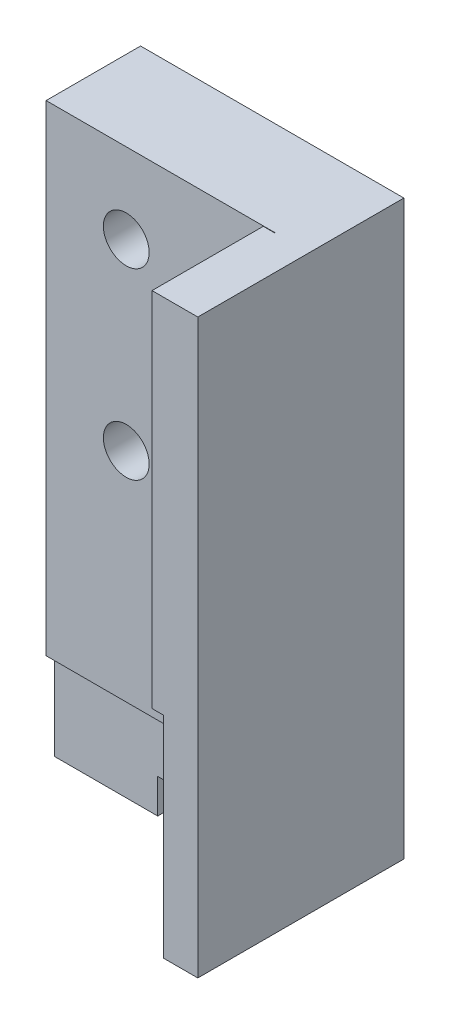
ISO-10303-21;
HEADER;
FILE_DESCRIPTION(('STEP AP214'),'2;1');
FILE_NAME('part.step','',(''),(''),'','','');
FILE_SCHEMA(('AUTOMOTIVE_DESIGN { 1 0 10303 214 1 1 1 1 }'));
ENDSEC;
DATA;
#1=APPLICATION_CONTEXT('core data for automotive mechanical design processes');
#2=APPLICATION_PROTOCOL_DEFINITION('international standard','automotive_design',2000,#1);
#3=PRODUCT_CONTEXT('',#1,'mechanical');
#4=PRODUCT('Part','Part','',(#3));
#5=PRODUCT_RELATED_PRODUCT_CATEGORY('part','',(#4));
#6=PRODUCT_DEFINITION_FORMATION('','',#4);
#7=PRODUCT_DEFINITION_CONTEXT('part definition',#1,'design');
#8=PRODUCT_DEFINITION('design','',#6,#7);
#9=PRODUCT_DEFINITION_SHAPE('','',#8);
#10=(LENGTH_UNIT() NAMED_UNIT(*) SI_UNIT(.MILLI.,.METRE.));
#11=(NAMED_UNIT(*) PLANE_ANGLE_UNIT() SI_UNIT($,.RADIAN.));
#12=(NAMED_UNIT(*) SI_UNIT($,.STERADIAN.) SOLID_ANGLE_UNIT());
#13=UNCERTAINTY_MEASURE_WITH_UNIT(LENGTH_MEASURE(1.E-05),#10,'distance_accuracy_value','');
#14=(GEOMETRIC_REPRESENTATION_CONTEXT(3) GLOBAL_UNCERTAINTY_ASSIGNED_CONTEXT((#13)) GLOBAL_UNIT_ASSIGNED_CONTEXT((#10,
#11,#12)) REPRESENTATION_CONTEXT('',''));
#15=CARTESIAN_POINT('',(0.,0.,0.));
#16=DIRECTION('',(0.,0.,1.));
#17=DIRECTION('',(1.,0.,0.));
#18=AXIS2_PLACEMENT_3D('',#15,#16,#17);
#19=CARTESIAN_POINT('',(20.,50.,9.));
#20=DIRECTION('',(1.,0.,0.));
#21=DIRECTION('',(0.,0.,-1.));
#22=AXIS2_PLACEMENT_3D('',#19,#20,#21);
#23=PLANE('',#22);
#24=DIRECTION('',(0.,-1.,0.));
#25=VECTOR('',#24,1.);
#26=CARTESIAN_POINT('',(20.,50.,-0.720000000000005));
#27=LINE('',#26,#25);
#28=CARTESIAN_POINT('',(20.,50.,-0.720000000000005));
#29=VERTEX_POINT('',#28);
#30=CARTESIAN_POINT('',(20.,18.3832892423228,-0.720000000000005));
#31=VERTEX_POINT('',#30);
#32=EDGE_CURVE('E169',#29,#31,#27,.T.);
#33=ORIENTED_EDGE('',*,*,#32,.F.);
#34=DIRECTION('',(0.,0.,1.));
#35=VECTOR('',#34,1.);
#36=CARTESIAN_POINT('',(20.,50.,9.));
#37=LINE('',#36,#35);
#38=CARTESIAN_POINT('',(20.,50.,-0.75));
#39=VERTEX_POINT('',#38);
#40=EDGE_CURVE('E151',#39,#29,#37,.T.);
#41=ORIENTED_EDGE('',*,*,#40,.F.);
#42=DIRECTION('',(0.,1.,0.));
#43=VECTOR('',#42,1.);
#44=CARTESIAN_POINT('',(20.,8.,-0.75));
#45=LINE('',#44,#43);
#46=CARTESIAN_POINT('',(20.,8.,-0.75));
#47=VERTEX_POINT('',#46);
#48=EDGE_CURVE('E184',#47,#39,#45,.T.);
#49=ORIENTED_EDGE('',*,*,#48,.F.);
#50=DIRECTION('',(0.,0.,1.));
#51=VECTOR('',#50,1.);
#52=CARTESIAN_POINT('',(20.,8.,0.));
#53=LINE('',#52,#51);
#54=CARTESIAN_POINT('',(20.,8.,-1.5));
#55=VERTEX_POINT('',#54);
#56=EDGE_CURVE('E238',#55,#47,#53,.T.);
#57=ORIENTED_EDGE('',*,*,#56,.F.);
#58=DIRECTION('',(0.,-1.,0.));
#59=VECTOR('',#58,1.);
#60=CARTESIAN_POINT('',(20.,8.,-1.5));
#61=LINE('',#60,#59);
#62=CARTESIAN_POINT('',(20.,0.,-1.5));
#63=VERTEX_POINT('',#62);
#64=EDGE_CURVE('E244',#55,#63,#61,.T.);
#65=ORIENTED_EDGE('',*,*,#64,.T.);
#66=DIRECTION('',(0.,0.,1.));
#67=VECTOR('',#66,1.);
#68=CARTESIAN_POINT('',(20.,0.,9.));
#69=LINE('',#68,#67);
#70=CARTESIAN_POINT('',(20.,0.,9.));
#71=VERTEX_POINT('',#70);
#72=EDGE_CURVE('E247',#63,#71,#69,.T.);
#73=ORIENTED_EDGE('',*,*,#72,.T.);
#74=DIRECTION('',(0.,-1.,0.));
#75=VECTOR('',#74,1.);
#76=CARTESIAN_POINT('',(20.,50.,9.));
#77=LINE('',#76,#75);
#78=CARTESIAN_POINT('',(20.,18.3832892423228,9.));
#79=VERTEX_POINT('',#78);
#80=EDGE_CURVE('E11',#79,#71,#77,.T.);
#81=ORIENTED_EDGE('',*,*,#80,.F.);
#82=DIRECTION('',(0.,0.,1.));
#83=VECTOR('',#82,1.);
#84=CARTESIAN_POINT('',(20.,18.3832892423228,9.));
#85=LINE('',#84,#83);
#86=EDGE_CURVE('E167',#31,#79,#85,.T.);
#87=ORIENTED_EDGE('',*,*,#86,.F.);
#88=EDGE_LOOP('',(#33,#41,#49,#57,#65,#73,#81,#87));
#89=FACE_BOUND('',#88,.T.);
#90=ADVANCED_FACE('F33',(#89),#23,.F.);
#91=CARTESIAN_POINT('',(0.,50.,0.));
#92=DIRECTION('',(1.,0.,0.));
#93=DIRECTION('',(0.,0.,-1.));
#94=AXIS2_PLACEMENT_3D('',#91,#92,#93);
#95=PLANE('',#94);
#96=DIRECTION('',(0.,-1.,0.));
#97=VECTOR('',#96,1.);
#98=CARTESIAN_POINT('',(0.,50.,-0.75));
#99=LINE('',#98,#97);
#100=CARTESIAN_POINT('',(0.,50.,-0.75));
#101=VERTEX_POINT('',#100);
#102=CARTESIAN_POINT('',(0.,8.,-0.75));
#103=VERTEX_POINT('',#102);
#104=EDGE_CURVE('E48',#101,#103,#99,.T.);
#105=ORIENTED_EDGE('',*,*,#104,.F.);
#106=DIRECTION('',(0.,0.,1.));
#107=VECTOR('',#106,1.);
#108=CARTESIAN_POINT('',(0.,50.,0.));
#109=LINE('',#108,#107);
#110=CARTESIAN_POINT('',(0.,50.,-9.));
#111=VERTEX_POINT('',#110);
#112=EDGE_CURVE('E254',#111,#101,#109,.T.);
#113=ORIENTED_EDGE('',*,*,#112,.F.);
#114=DIRECTION('',(0.,-1.,0.));
#115=VECTOR('',#114,1.);
#116=CARTESIAN_POINT('',(0.,50.,-9.));
#117=LINE('',#116,#115);
#118=CARTESIAN_POINT('',(0.,0.,-9.));
#119=VERTEX_POINT('',#118);
#120=EDGE_CURVE('E257',#111,#119,#117,.T.);
#121=ORIENTED_EDGE('',*,*,#120,.T.);
#122=DIRECTION('',(0.,0.,1.));
#123=VECTOR('',#122,1.);
#124=CARTESIAN_POINT('',(0.,0.,0.));
#125=LINE('',#124,#123);
#126=CARTESIAN_POINT('',(0.,0.,-1.5));
#127=VERTEX_POINT('',#126);
#128=EDGE_CURVE('E249',#119,#127,#125,.T.);
#129=ORIENTED_EDGE('',*,*,#128,.T.);
#130=DIRECTION('',(0.,-1.,0.));
#131=VECTOR('',#130,1.);
#132=CARTESIAN_POINT('',(0.,8.,-1.5));
#133=LINE('',#132,#131);
#134=CARTESIAN_POINT('',(0.,8.,-1.5));
#135=VERTEX_POINT('',#134);
#136=EDGE_CURVE('E241',#135,#127,#133,.T.);
#137=ORIENTED_EDGE('',*,*,#136,.F.);
#138=DIRECTION('',(0.,0.,-1.));
#139=VECTOR('',#138,1.);
#140=CARTESIAN_POINT('',(0.,8.,0.));
#141=LINE('',#140,#139);
#142=EDGE_CURVE('E232',#103,#135,#141,.T.);
#143=ORIENTED_EDGE('',*,*,#142,.F.);
#144=EDGE_LOOP('',(#105,#113,#121,#129,#137,#143));
#145=FACE_BOUND('',#144,.T.);
#146=ADVANCED_FACE('F294',(#145),#95,.F.);
#147=CARTESIAN_POINT('',(0.,8.,0.));
#148=DIRECTION('',(0.,-1.,0.));
#149=DIRECTION('',(0.,0.,-1.));
#150=AXIS2_PLACEMENT_3D('',#147,#148,#149);
#151=PLANE('',#150);
#152=ORIENTED_EDGE('',*,*,#56,.T.);
#153=DIRECTION('',(1.,0.,0.));
#154=VECTOR('',#153,1.);
#155=CARTESIAN_POINT('',(0.,8.,-0.75));
#156=LINE('',#155,#154);
#157=EDGE_CURVE('E182',#103,#47,#156,.T.);
#158=ORIENTED_EDGE('',*,*,#157,.F.);
#159=ORIENTED_EDGE('',*,*,#142,.T.);
#160=DIRECTION('',(1.,0.,0.));
#161=VECTOR('',#160,1.);
#162=CARTESIAN_POINT('',(0.,8.,-1.5));
#163=LINE('',#162,#161);
#164=EDGE_CURVE('E234',#135,#55,#163,.T.);
#165=ORIENTED_EDGE('',*,*,#164,.T.);
#166=EDGE_LOOP('',(#152,#158,#159,#165));
#167=FACE_BOUND('',#166,.T.);
#168=ADVANCED_FACE('F300',(#167),#151,.T.);
#169=CARTESIAN_POINT('',(7.,43.,5.65685424949238));
#170=DIRECTION('',(0.,0.,-1.));
#171=DIRECTION('',(-1.,0.,0.));
#172=AXIS2_PLACEMENT_3D('',#169,#170,#171);
#173=CYLINDRICAL_SURFACE('',#172,2.);
#174=CARTESIAN_POINT('',(7.,43.,-9.));
#175=DIRECTION('',(0.,0.,-1.));
#176=DIRECTION('',(-1.,0.,0.));
#177=AXIS2_PLACEMENT_3D('',#174,#175,#176);
#178=CIRCLE('',#177,2.);
#179=CARTESIAN_POINT('',(5.,43.,-9.));
#180=VERTEX_POINT('',#179);
#181=EDGE_CURVE('E192',#180,#180,#178,.T.);
#182=ORIENTED_EDGE('',*,*,#181,.T.);
#183=EDGE_LOOP('',(#182));
#184=FACE_BOUND('',#183,.T.);
#185=CARTESIAN_POINT('',(7.,43.,-0.75));
#186=DIRECTION('',(0.,0.,1.));
#187=DIRECTION('',(1.,0.,0.));
#188=AXIS2_PLACEMENT_3D('',#185,#186,#187);
#189=CIRCLE('',#188,2.);
#190=CARTESIAN_POINT('',(9.,43.,-0.75));
#191=VERTEX_POINT('',#190);
#192=EDGE_CURVE('E189',#191,#191,#189,.F.);
#193=ORIENTED_EDGE('',*,*,#192,.F.);
#194=EDGE_LOOP('',(#193));
#195=FACE_BOUND('',#194,.T.);
#196=ADVANCED_FACE('F318',(#184,#195),#173,.F.);
#197=CARTESIAN_POINT('',(7.,27.,5.65685424949238));
#198=DIRECTION('',(0.,0.,-1.));
#199=DIRECTION('',(-1.,0.,0.));
#200=AXIS2_PLACEMENT_3D('',#197,#198,#199);
#201=CYLINDRICAL_SURFACE('',#200,2.);
#202=CARTESIAN_POINT('',(7.,27.,-9.));
#203=DIRECTION('',(0.,0.,-1.));
#204=DIRECTION('',(-1.,0.,0.));
#205=AXIS2_PLACEMENT_3D('',#202,#203,#204);
#206=CIRCLE('',#205,2.);
#207=CARTESIAN_POINT('',(5.,27.,-9.));
#208=VERTEX_POINT('',#207);
#209=EDGE_CURVE('E193',#208,#208,#206,.T.);
#210=ORIENTED_EDGE('',*,*,#209,.T.);
#211=EDGE_LOOP('',(#210));
#212=FACE_BOUND('',#211,.T.);
#213=CARTESIAN_POINT('',(7.,27.,-0.75));
#214=DIRECTION('',(0.,0.,1.));
#215=DIRECTION('',(1.,0.,0.));
#216=AXIS2_PLACEMENT_3D('',#213,#214,#215);
#217=CIRCLE('',#216,2.);
#218=CARTESIAN_POINT('',(9.,27.,-0.75));
#219=VERTEX_POINT('',#218);
#220=EDGE_CURVE('E36',#219,#219,#217,.F.);
#221=ORIENTED_EDGE('',*,*,#220,.F.);
#222=EDGE_LOOP('',(#221));
#223=FACE_BOUND('',#222,.T.);
#224=ADVANCED_FACE('F320',(#212,#223),#201,.F.);
#225=CARTESIAN_POINT('',(0.,0.,0.));
#226=DIRECTION('',(0.,-1.,0.));
#227=DIRECTION('',(0.,0.,-1.));
#228=AXIS2_PLACEMENT_3D('',#225,#226,#227);
#229=PLANE('',#228);
#230=DIRECTION('',(0.,0.,1.));
#231=VECTOR('',#230,1.);
#232=CARTESIAN_POINT('',(9.,0.,-13.2426406871193));
#233=LINE('',#232,#231);
#234=CARTESIAN_POINT('',(9.,0.,-9.));
#235=VERTEX_POINT('',#234);
#236=CARTESIAN_POINT('',(9.,0.,-1.5));
#237=VERTEX_POINT('',#236);
#238=EDGE_CURVE('E213',#235,#237,#233,.T.);
#239=ORIENTED_EDGE('',*,*,#238,.T.);
#240=DIRECTION('',(1.,0.,0.));
#241=VECTOR('',#240,1.);
#242=CARTESIAN_POINT('',(0.,0.,-1.5));
#243=LINE('',#242,#241);
#244=EDGE_CURVE('E235',#127,#237,#243,.T.);
#245=ORIENTED_EDGE('',*,*,#244,.F.);
#246=ORIENTED_EDGE('',*,*,#128,.F.);
#247=DIRECTION('',(-1.,0.,0.));
#248=VECTOR('',#247,1.);
#249=CARTESIAN_POINT('',(0.,0.,-9.));
#250=LINE('',#249,#248);
#251=EDGE_CURVE('E264',#235,#119,#250,.T.);
#252=ORIENTED_EDGE('',*,*,#251,.F.);
#253=EDGE_LOOP('',(#239,#245,#246,#252));
#254=FACE_BOUND('',#253,.T.);
#255=CARTESIAN_POINT('',(5.,0.,-5.5));
#256=DIRECTION('',(0.,-1.,0.));
#257=DIRECTION('',(0.,0.,-1.));
#258=AXIS2_PLACEMENT_3D('',#255,#256,#257);
#259=CIRCLE('',#258,0.500000000000001);
#260=CARTESIAN_POINT('',(5.,0.,-6.));
#261=VERTEX_POINT('',#260);
#262=EDGE_CURVE('E224',#261,#261,#259,.T.);
#263=ORIENTED_EDGE('',*,*,#262,.F.);
#264=EDGE_LOOP('',(#263));
#265=FACE_BOUND('',#264,.T.);
#266=ADVANCED_FACE('F327',(#254,#265),#229,.T.);
#267=CARTESIAN_POINT('',(23.,50.,9.));
#268=DIRECTION('',(0.,0.,-1.));
#269=DIRECTION('',(-1.,0.,0.));
#270=AXIS2_PLACEMENT_3D('',#267,#268,#269);
#271=PLANE('',#270);
#272=DIRECTION('',(1.,0.,0.));
#273=VECTOR('',#272,1.);
#274=CARTESIAN_POINT('',(23.,0.,9.));
#275=LINE('',#274,#273);
#276=CARTESIAN_POINT('',(23.,0.,9.));
#277=VERTEX_POINT('',#276);
#278=EDGE_CURVE('E260',#71,#277,#275,.T.);
#279=ORIENTED_EDGE('',*,*,#278,.T.);
#280=DIRECTION('',(0.,-1.,0.));
#281=VECTOR('',#280,1.);
#282=CARTESIAN_POINT('',(23.,50.,9.));
#283=LINE('',#282,#281);
#284=CARTESIAN_POINT('',(23.,50.,9.));
#285=VERTEX_POINT('',#284);
#286=EDGE_CURVE('E41',#285,#277,#283,.T.);
#287=ORIENTED_EDGE('',*,*,#286,.F.);
#288=DIRECTION('',(1.,0.,0.));
#289=VECTOR('',#288,1.);
#290=CARTESIAN_POINT('',(23.,50.,9.));
#291=LINE('',#290,#289);
#292=CARTESIAN_POINT('',(19.,50.,9.));
#293=VERTEX_POINT('',#292);
#294=EDGE_CURVE('E141',#293,#285,#291,.T.);
#295=ORIENTED_EDGE('',*,*,#294,.F.);
#296=DIRECTION('',(0.,1.,0.));
#297=VECTOR('',#296,1.);
#298=CARTESIAN_POINT('',(19.,50.,9.));
#299=LINE('',#298,#297);
#300=CARTESIAN_POINT('',(19.,18.3832892423228,9.));
#301=VERTEX_POINT('',#300);
#302=EDGE_CURVE('E146',#301,#293,#299,.T.);
#303=ORIENTED_EDGE('',*,*,#302,.F.);
#304=DIRECTION('',(1.,0.,0.));
#305=VECTOR('',#304,1.);
#306=CARTESIAN_POINT('',(19.,18.3832892423228,9.));
#307=LINE('',#306,#305);
#308=EDGE_CURVE('E174',#301,#79,#307,.T.);
#309=ORIENTED_EDGE('',*,*,#308,.T.);
#310=ORIENTED_EDGE('',*,*,#80,.T.);
#311=EDGE_LOOP('',(#279,#287,#295,#303,#309,#310));
#312=FACE_BOUND('',#311,.T.);
#313=ADVANCED_FACE('F143',(#312),#271,.F.);
#314=CARTESIAN_POINT('',(23.,50.,-9.));
#315=DIRECTION('',(-1.,0.,0.));
#316=DIRECTION('',(0.,0.,1.));
#317=AXIS2_PLACEMENT_3D('',#314,#315,#316);
#318=PLANE('',#317);
#319=DIRECTION('',(0.,0.,-1.));
#320=VECTOR('',#319,1.);
#321=CARTESIAN_POINT('',(23.,0.,-9.));
#322=LINE('',#321,#320);
#323=CARTESIAN_POINT('',(23.,0.,-9.));
#324=VERTEX_POINT('',#323);
#325=EDGE_CURVE('E262',#277,#324,#322,.T.);
#326=ORIENTED_EDGE('',*,*,#325,.T.);
#327=DIRECTION('',(0.,-1.,0.));
#328=VECTOR('',#327,1.);
#329=CARTESIAN_POINT('',(23.,50.,-9.));
#330=LINE('',#329,#328);
#331=CARTESIAN_POINT('',(23.,50.,-9.));
#332=VERTEX_POINT('',#331);
#333=EDGE_CURVE('E272',#332,#324,#330,.T.);
#334=ORIENTED_EDGE('',*,*,#333,.F.);
#335=DIRECTION('',(0.,0.,-1.));
#336=VECTOR('',#335,1.);
#337=CARTESIAN_POINT('',(23.,50.,-9.));
#338=LINE('',#337,#336);
#339=EDGE_CURVE('E150',#285,#332,#338,.T.);
#340=ORIENTED_EDGE('',*,*,#339,.F.);
#341=ORIENTED_EDGE('',*,*,#286,.T.);
#342=EDGE_LOOP('',(#326,#334,#340,#341));
#343=FACE_BOUND('',#342,.T.);
#344=ADVANCED_FACE('F277',(#343),#318,.F.);
#345=CARTESIAN_POINT('',(0.,50.,-9.));
#346=DIRECTION('',(0.,0.,1.));
#347=DIRECTION('',(1.,0.,0.));
#348=AXIS2_PLACEMENT_3D('',#345,#346,#347);
#349=PLANE('',#348);
#350=ORIENTED_EDGE('',*,*,#209,.F.);
#351=EDGE_LOOP('',(#350));
#352=FACE_BOUND('',#351,.T.);
#353=ORIENTED_EDGE('',*,*,#181,.F.);
#354=EDGE_LOOP('',(#353));
#355=FACE_BOUND('',#354,.T.);
#356=DIRECTION('',(1.,0.,0.));
#357=VECTOR('',#356,1.);
#358=CARTESIAN_POINT('',(9.,3.,-9.));
#359=LINE('',#358,#357);
#360=CARTESIAN_POINT('',(9.,3.,-9.));
#361=VERTEX_POINT('',#360);
#362=CARTESIAN_POINT('',(12.,3.,-9.));
#363=VERTEX_POINT('',#362);
#364=EDGE_CURVE('E201',#361,#363,#359,.T.);
#365=ORIENTED_EDGE('',*,*,#364,.F.);
#366=DIRECTION('',(0.,1.,0.));
#367=VECTOR('',#366,1.);
#368=CARTESIAN_POINT('',(9.,0.,-9.));
#369=LINE('',#368,#367);
#370=EDGE_CURVE('E204',#235,#361,#369,.T.);
#371=ORIENTED_EDGE('',*,*,#370,.F.);
#372=ORIENTED_EDGE('',*,*,#251,.T.);
#373=ORIENTED_EDGE('',*,*,#120,.F.);
#374=DIRECTION('',(-1.,0.,0.));
#375=VECTOR('',#374,1.);
#376=CARTESIAN_POINT('',(0.,50.,-9.));
#377=LINE('',#376,#375);
#378=EDGE_CURVE('E252',#332,#111,#377,.T.);
#379=ORIENTED_EDGE('',*,*,#378,.F.);
#380=ORIENTED_EDGE('',*,*,#333,.T.);
#381=CARTESIAN_POINT('',(12.,0.,-9.));
#382=VERTEX_POINT('',#381);
#383=EDGE_CURVE('E265',#324,#382,#250,.T.);
#384=ORIENTED_EDGE('',*,*,#383,.T.);
#385=DIRECTION('',(0.,-1.,0.));
#386=VECTOR('',#385,1.);
#387=CARTESIAN_POINT('',(12.,0.,-9.));
#388=LINE('',#387,#386);
#389=EDGE_CURVE('E199',#363,#382,#388,.T.);
#390=ORIENTED_EDGE('',*,*,#389,.F.);
#391=EDGE_LOOP('',(#365,#371,#372,#373,#379,#380,#384,#390));
#392=FACE_BOUND('',#391,.T.);
#393=ADVANCED_FACE('F289',(#352,#355,#392),#349,.F.);
#394=CARTESIAN_POINT('',(0.,50.,0.));
#395=DIRECTION('',(0.,-1.,0.));
#396=DIRECTION('',(0.,0.,-1.));
#397=AXIS2_PLACEMENT_3D('',#394,#395,#396);
#398=PLANE('',#397);
#399=DIRECTION('',(-1.,0.,0.));
#400=VECTOR('',#399,1.);
#401=CARTESIAN_POINT('',(20.,50.,-0.75));
#402=LINE('',#401,#400);
#403=EDGE_CURVE('E187',#39,#101,#402,.T.);
#404=ORIENTED_EDGE('',*,*,#403,.F.);
#405=ORIENTED_EDGE('',*,*,#40,.T.);
#406=DIRECTION('',(1.,0.,0.));
#407=VECTOR('',#406,1.);
#408=CARTESIAN_POINT('',(19.,50.,-0.720000000000005));
#409=LINE('',#408,#407);
#410=CARTESIAN_POINT('',(19.,50.,-0.720000000000005));
#411=VERTEX_POINT('',#410);
#412=EDGE_CURVE('E158',#411,#29,#409,.T.);
#413=ORIENTED_EDGE('',*,*,#412,.F.);
#414=DIRECTION('',(0.,0.,-1.));
#415=VECTOR('',#414,1.);
#416=CARTESIAN_POINT('',(19.,50.,9.));
#417=LINE('',#416,#415);
#418=EDGE_CURVE('E154',#293,#411,#417,.T.);
#419=ORIENTED_EDGE('',*,*,#418,.F.);
#420=ORIENTED_EDGE('',*,*,#294,.T.);
#421=ORIENTED_EDGE('',*,*,#339,.T.);
#422=ORIENTED_EDGE('',*,*,#378,.T.);
#423=ORIENTED_EDGE('',*,*,#112,.T.);
#424=EDGE_LOOP('',(#404,#405,#413,#419,#420,#421,#422,#423));
#425=FACE_BOUND('',#424,.T.);
#426=ADVANCED_FACE('F156',(#425),#398,.F.);
#427=DIRECTION('',(0.,0.,1.));
#428=VECTOR('',#427,1.);
#429=CARTESIAN_POINT('',(12.,0.,-13.2426406871193));
#430=LINE('',#429,#428);
#431=CARTESIAN_POINT('',(12.,0.,-1.5));
#432=VERTEX_POINT('',#431);
#433=EDGE_CURVE('E56',#382,#432,#430,.T.);
#434=ORIENTED_EDGE('',*,*,#433,.F.);
#435=ORIENTED_EDGE('',*,*,#383,.F.);
#436=ORIENTED_EDGE('',*,*,#325,.F.);
#437=ORIENTED_EDGE('',*,*,#278,.F.);
#438=ORIENTED_EDGE('',*,*,#72,.F.);
#439=EDGE_CURVE('E223',#432,#63,#243,.T.);
#440=ORIENTED_EDGE('',*,*,#439,.F.);
#441=EDGE_LOOP('',(#434,#435,#436,#437,#438,#440));
#442=FACE_BOUND('',#441,.T.);
#443=CARTESIAN_POINT('',(15.,0.,-5.5));
#444=DIRECTION('',(0.,-1.,0.));
#445=DIRECTION('',(0.,0.,-1.));
#446=AXIS2_PLACEMENT_3D('',#443,#444,#445);
#447=CIRCLE('',#446,0.499999999999999);
#448=CARTESIAN_POINT('',(15.,0.,-6.));
#449=VERTEX_POINT('',#448);
#450=EDGE_CURVE('E206',#449,#449,#447,.T.);
#451=ORIENTED_EDGE('',*,*,#450,.F.);
#452=EDGE_LOOP('',(#451));
#453=FACE_BOUND('',#452,.T.);
#454=ADVANCED_FACE('F282',(#442,#453),#229,.T.);
#455=CARTESIAN_POINT('',(0.,8.,-1.5));
#456=DIRECTION('',(0.,0.,-1.));
#457=DIRECTION('',(-1.,0.,0.));
#458=AXIS2_PLACEMENT_3D('',#455,#456,#457);
#459=PLANE('',#458);
#460=ORIENTED_EDGE('',*,*,#244,.T.);
#461=DIRECTION('',(0.,-1.,0.));
#462=VECTOR('',#461,1.);
#463=CARTESIAN_POINT('',(9.,0.,-1.5));
#464=LINE('',#463,#462);
#465=CARTESIAN_POINT('',(9.,3.,-1.5));
#466=VERTEX_POINT('',#465);
#467=EDGE_CURVE('E196',#466,#237,#464,.T.);
#468=ORIENTED_EDGE('',*,*,#467,.F.);
#469=DIRECTION('',(-1.,0.,0.));
#470=VECTOR('',#469,1.);
#471=CARTESIAN_POINT('',(9.,3.,-1.5));
#472=LINE('',#471,#470);
#473=CARTESIAN_POINT('',(12.,3.,-1.5));
#474=VERTEX_POINT('',#473);
#475=EDGE_CURVE('E210',#474,#466,#472,.T.);
#476=ORIENTED_EDGE('',*,*,#475,.F.);
#477=DIRECTION('',(0.,1.,0.));
#478=VECTOR('',#477,1.);
#479=CARTESIAN_POINT('',(12.,0.,-1.5));
#480=LINE('',#479,#478);
#481=EDGE_CURVE('E208',#432,#474,#480,.T.);
#482=ORIENTED_EDGE('',*,*,#481,.F.);
#483=ORIENTED_EDGE('',*,*,#439,.T.);
#484=ORIENTED_EDGE('',*,*,#64,.F.);
#485=ORIENTED_EDGE('',*,*,#164,.F.);
#486=ORIENTED_EDGE('',*,*,#136,.T.);
#487=EDGE_LOOP('',(#460,#468,#476,#482,#483,#484,#485,#486));
#488=FACE_BOUND('',#487,.T.);
#489=ADVANCED_FACE('F302',(#488),#459,.F.);
#490=CARTESIAN_POINT('',(15.,8.,-5.5));
#491=DIRECTION('',(0.,-1.,0.));
#492=DIRECTION('',(0.,0.,-1.));
#493=AXIS2_PLACEMENT_3D('',#490,#491,#492);
#494=CYLINDRICAL_SURFACE('',#493,0.499999999999999);
#495=CARTESIAN_POINT('',(15.,8.,-5.5));
#496=DIRECTION('',(0.,-1.,0.));
#497=DIRECTION('',(0.,0.,-1.));
#498=AXIS2_PLACEMENT_3D('',#495,#496,#497);
#499=CIRCLE('',#498,0.499999999999999);
#500=CARTESIAN_POINT('',(15.,8.,-6.));
#501=VERTEX_POINT('',#500);
#502=EDGE_CURVE('E227',#501,#501,#499,.T.);
#503=ORIENTED_EDGE('',*,*,#502,.F.);
#504=EDGE_LOOP('',(#503));
#505=FACE_BOUND('',#504,.T.);
#506=ORIENTED_EDGE('',*,*,#450,.T.);
#507=EDGE_LOOP('',(#506));
#508=FACE_BOUND('',#507,.T.);
#509=ADVANCED_FACE('F359',(#505,#508),#494,.F.);
#510=CARTESIAN_POINT('',(15.,8.,-5.5));
#511=DIRECTION('',(0.,-1.,0.));
#512=DIRECTION('',(0.,0.,-1.));
#513=AXIS2_PLACEMENT_3D('',#510,#511,#512);
#514=PLANE('',#513);
#515=ORIENTED_EDGE('',*,*,#502,.T.);
#516=EDGE_LOOP('',(#515));
#517=FACE_BOUND('',#516,.T.);
#518=ADVANCED_FACE('F366',(#517),#514,.T.);
#519=CARTESIAN_POINT('',(5.,8.,-5.5));
#520=DIRECTION('',(0.,-1.,0.));
#521=DIRECTION('',(0.,0.,-1.));
#522=AXIS2_PLACEMENT_3D('',#519,#520,#521);
#523=CYLINDRICAL_SURFACE('',#522,0.500000000000001);
#524=CARTESIAN_POINT('',(5.,8.,-5.5));
#525=DIRECTION('',(0.,-1.,0.));
#526=DIRECTION('',(0.,0.,-1.));
#527=AXIS2_PLACEMENT_3D('',#524,#525,#526);
#528=CIRCLE('',#527,0.500000000000001);
#529=CARTESIAN_POINT('',(5.,8.,-6.));
#530=VERTEX_POINT('',#529);
#531=EDGE_CURVE('E220',#530,#530,#528,.T.);
#532=ORIENTED_EDGE('',*,*,#531,.F.);
#533=EDGE_LOOP('',(#532));
#534=FACE_BOUND('',#533,.T.);
#535=ORIENTED_EDGE('',*,*,#262,.T.);
#536=EDGE_LOOP('',(#535));
#537=FACE_BOUND('',#536,.T.);
#538=ADVANCED_FACE('F370',(#534,#537),#523,.F.);
#539=CARTESIAN_POINT('',(5.,8.,-5.5));
#540=DIRECTION('',(0.,-1.,0.));
#541=DIRECTION('',(0.,0.,-1.));
#542=AXIS2_PLACEMENT_3D('',#539,#540,#541);
#543=PLANE('',#542);
#544=ORIENTED_EDGE('',*,*,#531,.T.);
#545=EDGE_LOOP('',(#544));
#546=FACE_BOUND('',#545,.T.);
#547=ADVANCED_FACE('F374',(#546),#543,.T.);
#548=CARTESIAN_POINT('',(9.,0.,-13.2426406871193));
#549=DIRECTION('',(-1.,0.,0.));
#550=DIRECTION('',(0.,0.,1.));
#551=AXIS2_PLACEMENT_3D('',#548,#549,#550);
#552=PLANE('',#551);
#553=ORIENTED_EDGE('',*,*,#370,.T.);
#554=DIRECTION('',(0.,0.,1.));
#555=VECTOR('',#554,1.);
#556=CARTESIAN_POINT('',(9.,3.,-13.2426406871193));
#557=LINE('',#556,#555);
#558=EDGE_CURVE('E202',#361,#466,#557,.T.);
#559=ORIENTED_EDGE('',*,*,#558,.T.);
#560=ORIENTED_EDGE('',*,*,#467,.T.);
#561=ORIENTED_EDGE('',*,*,#238,.F.);
#562=EDGE_LOOP('',(#553,#559,#560,#561));
#563=FACE_BOUND('',#562,.T.);
#564=ADVANCED_FACE('F378',(#563),#552,.F.);
#565=CARTESIAN_POINT('',(9.,3.,-13.2426406871193));
#566=DIRECTION('',(0.,1.,0.));
#567=DIRECTION('',(-1.,0.,0.));
#568=AXIS2_PLACEMENT_3D('',#565,#566,#567);
#569=PLANE('',#568);
#570=ORIENTED_EDGE('',*,*,#364,.T.);
#571=DIRECTION('',(0.,0.,1.));
#572=VECTOR('',#571,1.);
#573=CARTESIAN_POINT('',(12.,3.,-13.2426406871193));
#574=LINE('',#573,#572);
#575=EDGE_CURVE('E215',#363,#474,#574,.T.);
#576=ORIENTED_EDGE('',*,*,#575,.T.);
#577=ORIENTED_EDGE('',*,*,#475,.T.);
#578=ORIENTED_EDGE('',*,*,#558,.F.);
#579=EDGE_LOOP('',(#570,#576,#577,#578));
#580=FACE_BOUND('',#579,.T.);
#581=ADVANCED_FACE('F382',(#580),#569,.F.);
#582=CARTESIAN_POINT('',(12.,0.,-13.2426406871193));
#583=DIRECTION('',(1.,0.,0.));
#584=DIRECTION('',(0.,0.,-1.));
#585=AXIS2_PLACEMENT_3D('',#582,#583,#584);
#586=PLANE('',#585);
#587=ORIENTED_EDGE('',*,*,#389,.T.);
#588=ORIENTED_EDGE('',*,*,#433,.T.);
#589=ORIENTED_EDGE('',*,*,#481,.T.);
#590=ORIENTED_EDGE('',*,*,#575,.F.);
#591=EDGE_LOOP('',(#587,#588,#589,#590));
#592=FACE_BOUND('',#591,.T.);
#593=ADVANCED_FACE('F311',(#592),#586,.F.);
#594=CARTESIAN_POINT('',(0.,0.,-0.75));
#595=DIRECTION('',(0.,0.,1.));
#596=DIRECTION('',(1.,0.,0.));
#597=AXIS2_PLACEMENT_3D('',#594,#595,#596);
#598=PLANE('',#597);
#599=ORIENTED_EDGE('',*,*,#104,.T.);
#600=ORIENTED_EDGE('',*,*,#157,.T.);
#601=ORIENTED_EDGE('',*,*,#48,.T.);
#602=ORIENTED_EDGE('',*,*,#403,.T.);
#603=EDGE_LOOP('',(#599,#600,#601,#602));
#604=FACE_BOUND('',#603,.T.);
#605=ORIENTED_EDGE('',*,*,#220,.T.);
#606=EDGE_LOOP('',(#605));
#607=FACE_BOUND('',#606,.T.);
#608=ORIENTED_EDGE('',*,*,#192,.T.);
#609=EDGE_LOOP('',(#608));
#610=FACE_BOUND('',#609,.T.);
#611=ADVANCED_FACE('F307',(#604,#607,#610),#598,.T.);
#612=CARTESIAN_POINT('',(19.,50.,-0.720000000000005));
#613=DIRECTION('',(0.,0.,1.));
#614=DIRECTION('',(1.,0.,0.));
#615=AXIS2_PLACEMENT_3D('',#612,#613,#614);
#616=PLANE('',#615);
#617=ORIENTED_EDGE('',*,*,#32,.T.);
#618=DIRECTION('',(1.,0.,0.));
#619=VECTOR('',#618,1.);
#620=CARTESIAN_POINT('',(19.,18.3832892423228,-0.720000000000005));
#621=LINE('',#620,#619);
#622=CARTESIAN_POINT('',(19.,18.3832892423228,-0.720000000000005));
#623=VERTEX_POINT('',#622);
#624=EDGE_CURVE('E177',#623,#31,#621,.T.);
#625=ORIENTED_EDGE('',*,*,#624,.F.);
#626=DIRECTION('',(0.,-1.,0.));
#627=VECTOR('',#626,1.);
#628=CARTESIAN_POINT('',(19.,50.,-0.720000000000005));
#629=LINE('',#628,#627);
#630=EDGE_CURVE('E161',#411,#623,#629,.T.);
#631=ORIENTED_EDGE('',*,*,#630,.F.);
#632=ORIENTED_EDGE('',*,*,#412,.T.);
#633=EDGE_LOOP('',(#617,#625,#631,#632));
#634=FACE_BOUND('',#633,.T.);
#635=ADVANCED_FACE('F310',(#634),#616,.F.);
#636=CARTESIAN_POINT('',(19.,18.3832892423228,9.));
#637=DIRECTION('',(0.,1.,0.));
#638=DIRECTION('',(0.,0.,1.));
#639=AXIS2_PLACEMENT_3D('',#636,#637,#638);
#640=PLANE('',#639);
#641=ORIENTED_EDGE('',*,*,#86,.T.);
#642=ORIENTED_EDGE('',*,*,#308,.F.);
#643=DIRECTION('',(0.,0.,1.));
#644=VECTOR('',#643,1.);
#645=CARTESIAN_POINT('',(19.,18.3832892423228,9.));
#646=LINE('',#645,#644);
#647=EDGE_CURVE('E165',#623,#301,#646,.T.);
#648=ORIENTED_EDGE('',*,*,#647,.F.);
#649=ORIENTED_EDGE('',*,*,#624,.T.);
#650=EDGE_LOOP('',(#641,#642,#648,#649));
#651=FACE_BOUND('',#650,.T.);
#652=ADVANCED_FACE('F398',(#651),#640,.F.);
#653=CARTESIAN_POINT('',(19.,0.,0.));
#654=DIRECTION('',(1.,0.,0.));
#655=DIRECTION('',(0.,0.,-1.));
#656=AXIS2_PLACEMENT_3D('',#653,#654,#655);
#657=PLANE('',#656);
#658=ORIENTED_EDGE('',*,*,#302,.T.);
#659=ORIENTED_EDGE('',*,*,#418,.T.);
#660=ORIENTED_EDGE('',*,*,#630,.T.);
#661=ORIENTED_EDGE('',*,*,#647,.T.);
#662=EDGE_LOOP('',(#658,#659,#660,#661));
#663=FACE_BOUND('',#662,.T.);
#664=ADVANCED_FACE('F163',(#663),#657,.F.);
#665=CLOSED_SHELL('',(#90,#146,#168,#196,#224,#266,#313,#344,#393,#426,#454,#489,#509,#518,#538,
#547,#564,#581,#593,#611,#635,#652,#664));
#666=MANIFOLD_SOLID_BREP('B2',#665);
#667=ADVANCED_BREP_SHAPE_REPRESENTATION('',(#18,#666),#14);
#668=SHAPE_DEFINITION_REPRESENTATION(#9,#667);
ENDSEC;
END-ISO-10303-21;
